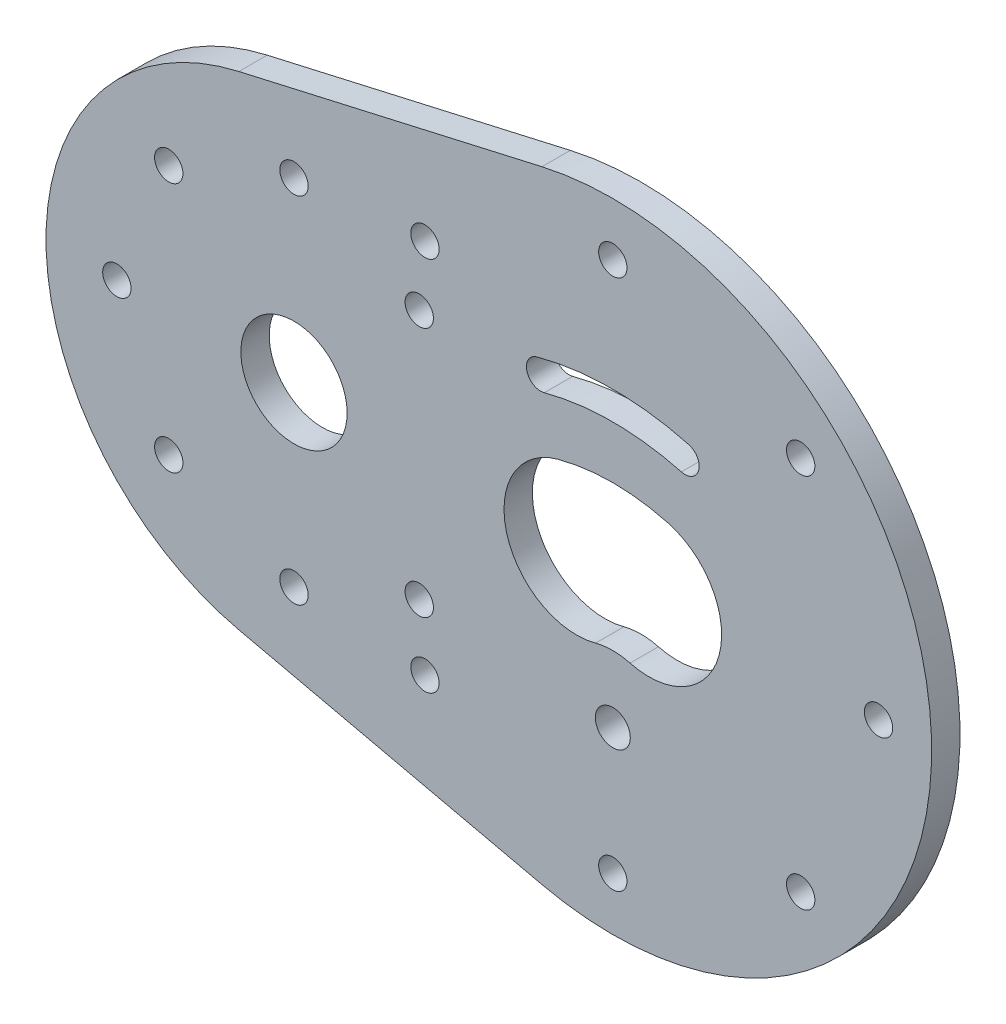
ISO-10303-21;
HEADER;
FILE_DESCRIPTION(('STEP AP214'),'2;1');
FILE_NAME('part.step','',(''),(''),'','','');
FILE_SCHEMA(('AUTOMOTIVE_DESIGN { 1 0 10303 214 1 1 1 1 }'));
ENDSEC;
DATA;
#1=APPLICATION_CONTEXT('core data for automotive mechanical design processes');
#2=APPLICATION_PROTOCOL_DEFINITION('international standard','automotive_design',2000,#1);
#3=PRODUCT_CONTEXT('',#1,'mechanical');
#4=PRODUCT('Part','Part','',(#3));
#5=PRODUCT_RELATED_PRODUCT_CATEGORY('part','',(#4));
#6=PRODUCT_DEFINITION_FORMATION('','',#4);
#7=PRODUCT_DEFINITION_CONTEXT('part definition',#1,'design');
#8=PRODUCT_DEFINITION('design','',#6,#7);
#9=PRODUCT_DEFINITION_SHAPE('','',#8);
#10=(LENGTH_UNIT() NAMED_UNIT(*) SI_UNIT(.MILLI.,.METRE.));
#11=(NAMED_UNIT(*) PLANE_ANGLE_UNIT() SI_UNIT($,.RADIAN.));
#12=(NAMED_UNIT(*) SI_UNIT($,.STERADIAN.) SOLID_ANGLE_UNIT());
#13=UNCERTAINTY_MEASURE_WITH_UNIT(LENGTH_MEASURE(1.E-05),#10,'distance_accuracy_value','');
#14=(GEOMETRIC_REPRESENTATION_CONTEXT(3) GLOBAL_UNCERTAINTY_ASSIGNED_CONTEXT((#13)) GLOBAL_UNIT_ASSIGNED_CONTEXT((#10,
#11,#12)) REPRESENTATION_CONTEXT('',''));
#15=CARTESIAN_POINT('',(0.,0.,0.));
#16=DIRECTION('',(0.,0.,1.));
#17=DIRECTION('',(1.,0.,0.));
#18=AXIS2_PLACEMENT_3D('',#15,#16,#17);
#19=CARTESIAN_POINT('',(35.4686704501793,-31.95,2.54));
#20=DIRECTION('',(0.,0.,1.));
#21=DIRECTION('',(1.,0.,0.));
#22=AXIS2_PLACEMENT_3D('',#19,#20,#21);
#23=PLANE('',#22);
#24=CARTESIAN_POINT('',(-16.8379802270047,29.3379802270047,2.54));
#25=DIRECTION('',(0.,0.,1.));
#26=DIRECTION('',(1.,0.,0.));
#27=AXIS2_PLACEMENT_3D('',#24,#25,#26);
#28=CIRCLE('',#27,1.27);
#29=CARTESIAN_POINT('',(-15.5679802270047,29.3379802270047,2.54));
#30=VERTEX_POINT('',#29);
#31=EDGE_CURVE('E333',#30,#30,#28,.T.);
#32=ORIENTED_EDGE('',*,*,#31,.F.);
#33=EDGE_LOOP('',(#32));
#34=FACE_BOUND('',#33,.T.);
#35=CARTESIAN_POINT('',(-16.8379802270047,-4.33798022700466,2.54));
#36=DIRECTION('',(0.,0.,1.));
#37=DIRECTION('',(1.,0.,0.));
#38=AXIS2_PLACEMENT_3D('',#35,#36,#37);
#39=CIRCLE('',#38,1.27000000000001);
#40=CARTESIAN_POINT('',(-15.5679802270046,-4.33798022700466,2.54));
#41=VERTEX_POINT('',#40);
#42=EDGE_CURVE('E327',#41,#41,#39,.T.);
#43=ORIENTED_EDGE('',*,*,#42,.F.);
#44=EDGE_LOOP('',(#43));
#45=FACE_BOUND('',#44,.T.);
#46=CARTESIAN_POINT('',(0.,-11.3125,2.54));
#47=DIRECTION('',(0.,0.,1.));
#48=DIRECTION('',(1.,0.,0.));
#49=AXIS2_PLACEMENT_3D('',#46,#47,#48);
#50=CIRCLE('',#49,1.27);
#51=CARTESIAN_POINT('',(1.27,-11.3125,2.54));
#52=VERTEX_POINT('',#51);
#53=EDGE_CURVE('E321',#52,#52,#50,.T.);
#54=ORIENTED_EDGE('',*,*,#53,.F.);
#55=EDGE_LOOP('',(#54));
#56=FACE_BOUND('',#55,.T.);
#57=CARTESIAN_POINT('',(16.8379802270047,-4.33798022700466,2.54));
#58=DIRECTION('',(0.,0.,1.));
#59=DIRECTION('',(1.,0.,0.));
#60=AXIS2_PLACEMENT_3D('',#57,#58,#59);
#61=CIRCLE('',#60,1.27);
#62=CARTESIAN_POINT('',(18.1079802270047,-4.33798022700466,2.54));
#63=VERTEX_POINT('',#62);
#64=EDGE_CURVE('E315',#63,#63,#61,.T.);
#65=ORIENTED_EDGE('',*,*,#64,.F.);
#66=EDGE_LOOP('',(#65));
#67=FACE_BOUND('',#66,.T.);
#68=CARTESIAN_POINT('',(23.8125,12.5,2.54));
#69=DIRECTION('',(0.,0.,1.));
#70=DIRECTION('',(1.,0.,0.));
#71=AXIS2_PLACEMENT_3D('',#68,#69,#70);
#72=CIRCLE('',#71,1.27);
#73=CARTESIAN_POINT('',(25.0825,12.5,2.54));
#74=VERTEX_POINT('',#73);
#75=EDGE_CURVE('E309',#74,#74,#72,.T.);
#76=ORIENTED_EDGE('',*,*,#75,.F.);
#77=EDGE_LOOP('',(#76));
#78=FACE_BOUND('',#77,.T.);
#79=CARTESIAN_POINT('',(16.8379802270047,29.3379802270047,2.54));
#80=DIRECTION('',(0.,0.,1.));
#81=DIRECTION('',(1.,0.,0.));
#82=AXIS2_PLACEMENT_3D('',#79,#80,#81);
#83=CIRCLE('',#82,1.27);
#84=CARTESIAN_POINT('',(18.1079802270047,29.3379802270047,2.54));
#85=VERTEX_POINT('',#84);
#86=EDGE_CURVE('E303',#85,#85,#83,.T.);
#87=ORIENTED_EDGE('',*,*,#86,.F.);
#88=EDGE_LOOP('',(#87));
#89=FACE_BOUND('',#88,.T.);
#90=CARTESIAN_POINT('',(-39.8003201513362,23.7253201513364,2.54));
#91=DIRECTION('',(0.,0.,1.));
#92=DIRECTION('',(1.,0.,0.));
#93=AXIS2_PLACEMENT_3D('',#90,#91,#92);
#94=CIRCLE('',#93,1.27);
#95=CARTESIAN_POINT('',(-38.5303201513362,23.7253201513364,2.54));
#96=VERTEX_POINT('',#95);
#97=EDGE_CURVE('E297',#96,#96,#94,.T.);
#98=ORIENTED_EDGE('',*,*,#97,.F.);
#99=EDGE_LOOP('',(#98));
#100=FACE_BOUND('',#99,.T.);
#101=CARTESIAN_POINT('',(-44.4499999999998,12.5,2.54));
#102=DIRECTION('',(0.,0.,1.));
#103=DIRECTION('',(1.,0.,0.));
#104=AXIS2_PLACEMENT_3D('',#101,#102,#103);
#105=CIRCLE('',#104,1.27);
#106=CARTESIAN_POINT('',(-43.1799999999998,12.5,2.54));
#107=VERTEX_POINT('',#106);
#108=EDGE_CURVE('E291',#107,#107,#105,.T.);
#109=ORIENTED_EDGE('',*,*,#108,.F.);
#110=EDGE_LOOP('',(#109));
#111=FACE_BOUND('',#110,.T.);
#112=CARTESIAN_POINT('',(-39.8003201513362,1.2746798486635,2.54));
#113=DIRECTION('',(0.,0.,1.));
#114=DIRECTION('',(1.,0.,0.));
#115=AXIS2_PLACEMENT_3D('',#112,#113,#114);
#116=CIRCLE('',#115,1.27);
#117=CARTESIAN_POINT('',(-38.5303201513362,1.2746798486635,2.54));
#118=VERTEX_POINT('',#117);
#119=EDGE_CURVE('E285',#118,#118,#116,.T.);
#120=ORIENTED_EDGE('',*,*,#119,.F.);
#121=EDGE_LOOP('',(#120));
#122=FACE_BOUND('',#121,.T.);
#123=CARTESIAN_POINT('',(-28.5749999999997,-3.375,2.54));
#124=DIRECTION('',(0.,0.,1.));
#125=DIRECTION('',(1.,0.,0.));
#126=AXIS2_PLACEMENT_3D('',#123,#124,#125);
#127=CIRCLE('',#126,1.27);
#128=CARTESIAN_POINT('',(-27.3049999999997,-3.375,2.54));
#129=VERTEX_POINT('',#128);
#130=EDGE_CURVE('E279',#129,#129,#127,.T.);
#131=ORIENTED_EDGE('',*,*,#130,.F.);
#132=EDGE_LOOP('',(#131));
#133=FACE_BOUND('',#132,.T.);
#134=CARTESIAN_POINT('',(-17.3496798486632,1.27467984866366,2.54));
#135=DIRECTION('',(0.,0.,1.));
#136=DIRECTION('',(1.,0.,0.));
#137=AXIS2_PLACEMENT_3D('',#134,#135,#136);
#138=CIRCLE('',#137,1.27);
#139=CARTESIAN_POINT('',(-16.0796798486632,1.27467984866366,2.54));
#140=VERTEX_POINT('',#139);
#141=EDGE_CURVE('E273',#140,#140,#138,.T.);
#142=ORIENTED_EDGE('',*,*,#141,.F.);
#143=EDGE_LOOP('',(#142));
#144=FACE_BOUND('',#143,.T.);
#145=CARTESIAN_POINT('',(-17.3496798486635,23.7253201513366,2.54));
#146=DIRECTION('',(0.,0.,1.));
#147=DIRECTION('',(1.,0.,0.));
#148=AXIS2_PLACEMENT_3D('',#145,#146,#147);
#149=CIRCLE('',#148,1.27000000000001);
#150=CARTESIAN_POINT('',(-16.0796798486635,23.7253201513366,2.54));
#151=VERTEX_POINT('',#150);
#152=EDGE_CURVE('E267',#151,#151,#149,.T.);
#153=ORIENTED_EDGE('',*,*,#152,.F.);
#154=EDGE_LOOP('',(#153));
#155=FACE_BOUND('',#154,.T.);
#156=CARTESIAN_POINT('',(0.,36.3125,2.54));
#157=DIRECTION('',(0.,0.,1.));
#158=DIRECTION('',(1.,0.,0.));
#159=AXIS2_PLACEMENT_3D('',#156,#157,#158);
#160=CIRCLE('',#159,1.27);
#161=CARTESIAN_POINT('',(1.27,36.3125,2.54));
#162=VERTEX_POINT('',#161);
#163=EDGE_CURVE('E261',#162,#162,#160,.T.);
#164=ORIENTED_EDGE('',*,*,#163,.F.);
#165=EDGE_LOOP('',(#164));
#166=FACE_BOUND('',#165,.T.);
#167=CARTESIAN_POINT('',(-28.575,28.375,2.54));
#168=DIRECTION('',(0.,0.,1.));
#169=DIRECTION('',(1.,0.,0.));
#170=AXIS2_PLACEMENT_3D('',#167,#168,#169);
#171=CIRCLE('',#170,1.27);
#172=CARTESIAN_POINT('',(-27.305,28.375,2.54));
#173=VERTEX_POINT('',#172);
#174=EDGE_CURVE('E255',#173,#173,#171,.T.);
#175=ORIENTED_EDGE('',*,*,#174,.F.);
#176=EDGE_LOOP('',(#175));
#177=FACE_BOUND('',#176,.T.);
#178=CARTESIAN_POINT('',(-28.575,12.5,2.54));
#179=DIRECTION('',(0.,0.,1.));
#180=DIRECTION('',(1.,0.,0.));
#181=AXIS2_PLACEMENT_3D('',#178,#179,#180);
#182=CIRCLE('',#181,4.7625);
#183=CARTESIAN_POINT('',(-23.8125,12.5,2.54));
#184=VERTEX_POINT('',#183);
#185=EDGE_CURVE('E155',#184,#184,#182,.T.);
#186=ORIENTED_EDGE('',*,*,#185,.F.);
#187=EDGE_LOOP('',(#186));
#188=FACE_BOUND('',#187,.T.);
#189=CARTESIAN_POINT('',(0.,0.,2.54));
#190=DIRECTION('',(0.,0.,1.));
#191=DIRECTION('',(1.,0.,0.));
#192=AXIS2_PLACEMENT_3D('',#189,#190,#191);
#193=CIRCLE('',#192,1.56488027551501);
#194=CARTESIAN_POINT('',(1.56488027551501,0.,2.54));
#195=VERTEX_POINT('',#194);
#196=EDGE_CURVE('E192',#195,#195,#193,.T.);
#197=ORIENTED_EDGE('',*,*,#196,.F.);
#198=EDGE_LOOP('',(#197));
#199=FACE_BOUND('',#198,.T.);
#200=CARTESIAN_POINT('',(3.23523806378152,12.0740728286134,2.54));
#201=DIRECTION('',(0.,0.,1.));
#202=DIRECTION('',(-1.,0.,0.));
#203=AXIS2_PLACEMENT_3D('',#200,#201,#202);
#204=CIRCLE('',#203,6.5151);
#205=CARTESIAN_POINT('',(1.54900610303408,5.78096947775744,2.54));
#206=VERTEX_POINT('',#205);
#207=CARTESIAN_POINT('',(4.92147002452896,18.3671761794693,2.54));
#208=VERTEX_POINT('',#207);
#209=EDGE_CURVE('E200',#206,#208,#204,.T.);
#210=ORIENTED_EDGE('',*,*,#209,.F.);
#211=CARTESIAN_POINT('',(0.,0.,2.54));
#212=DIRECTION('',(0.,0.,-1.));
#213=DIRECTION('',(1.,0.,0.));
#214=AXIS2_PLACEMENT_3D('',#211,#212,#213);
#215=CIRCLE('',#214,5.9849);
#216=CARTESIAN_POINT('',(-1.54900610303408,5.78096947775744,2.54));
#217=VERTEX_POINT('',#216);
#218=EDGE_CURVE('E198',#217,#206,#215,.T.);
#219=ORIENTED_EDGE('',*,*,#218,.F.);
#220=CARTESIAN_POINT('',(-3.23523806378152,12.0740728286134,2.54));
#221=DIRECTION('',(0.,0.,1.));
#222=DIRECTION('',(1.,0.,0.));
#223=AXIS2_PLACEMENT_3D('',#220,#221,#222);
#224=CIRCLE('',#223,6.5151);
#225=CARTESIAN_POINT('',(-4.92147002452896,18.3671761794693,2.54));
#226=VERTEX_POINT('',#225);
#227=EDGE_CURVE('E206',#226,#217,#224,.T.);
#228=ORIENTED_EDGE('',*,*,#227,.F.);
#229=CARTESIAN_POINT('',(0.,0.,2.54));
#230=DIRECTION('',(0.,0.,1.));
#231=DIRECTION('',(1.,0.,0.));
#232=AXIS2_PLACEMENT_3D('',#229,#230,#231);
#233=CIRCLE('',#232,19.0151);
#234=EDGE_CURVE('E203',#208,#226,#233,.T.);
#235=ORIENTED_EDGE('',*,*,#234,.F.);
#236=EDGE_LOOP('',(#210,#219,#228,#235));
#237=FACE_BOUND('',#236,.T.);
#238=CARTESIAN_POINT('',(0.,0.,2.54));
#239=DIRECTION('',(0.,0.,-1.));
#240=DIRECTION('',(1.,0.,0.));
#241=AXIS2_PLACEMENT_3D('',#238,#239,#240);
#242=CIRCLE('',#241,23.73);
#243=CARTESIAN_POINT('',(-6.14177594028284,22.9214198578396,2.54));
#244=VERTEX_POINT('',#243);
#245=CARTESIAN_POINT('',(6.14177594028284,22.9214198578396,2.54));
#246=VERTEX_POINT('',#245);
#247=EDGE_CURVE('E163',#244,#246,#242,.T.);
#248=ORIENTED_EDGE('',*,*,#247,.F.);
#249=CARTESIAN_POINT('',(-6.47047612756304,24.1481456572267,2.54));
#250=DIRECTION('',(0.,0.,1.));
#251=DIRECTION('',(1.,0.,0.));
#252=AXIS2_PLACEMENT_3D('',#249,#250,#251);
#253=CIRCLE('',#252,1.27);
#254=CARTESIAN_POINT('',(-6.79917631484324,25.3748714566138,2.54));
#255=VERTEX_POINT('',#254);
#256=EDGE_CURVE('E161',#255,#244,#253,.T.);
#257=ORIENTED_EDGE('',*,*,#256,.F.);
#258=CARTESIAN_POINT('',(0.,0.,2.54));
#259=DIRECTION('',(0.,0.,1.));
#260=DIRECTION('',(1.,0.,0.));
#261=AXIS2_PLACEMENT_3D('',#258,#259,#260);
#262=CIRCLE('',#261,26.27);
#263=CARTESIAN_POINT('',(6.79917631484324,25.3748714566138,2.54));
#264=VERTEX_POINT('',#263);
#265=EDGE_CURVE('E169',#264,#255,#262,.T.);
#266=ORIENTED_EDGE('',*,*,#265,.F.);
#267=CARTESIAN_POINT('',(6.47047612756304,24.1481456572267,2.54));
#268=DIRECTION('',(0.,0.,1.));
#269=DIRECTION('',(-1.,0.,0.));
#270=AXIS2_PLACEMENT_3D('',#267,#268,#269);
#271=CIRCLE('',#270,1.27);
#272=EDGE_CURVE('E166',#246,#264,#271,.T.);
#273=ORIENTED_EDGE('',*,*,#272,.F.);
#274=EDGE_LOOP('',(#248,#257,#266,#273));
#275=FACE_BOUND('',#274,.T.);
#276=DIRECTION('',(-0.974996043043569,-0.222222222222222,0.));
#277=VECTOR('',#276,1.);
#278=CARTESIAN_POINT('',(-33.5138888888889,34.1692870566433,2.54));
#279=LINE('',#278,#277);
#280=CARTESIAN_POINT('',(-6.35000000000002,40.36051192997,2.54));
#281=VERTEX_POINT('',#280);
#282=CARTESIAN_POINT('',(-33.5138888888889,34.1692870566433,2.54));
#283=VERTEX_POINT('',#282);
#284=EDGE_CURVE('E126',#281,#283,#279,.T.);
#285=ORIENTED_EDGE('',*,*,#284,.T.);
#286=CARTESIAN_POINT('',(-28.575,12.5,2.54));
#287=DIRECTION('',(0.,0.,1.));
#288=DIRECTION('',(1.,0.,0.));
#289=AXIS2_PLACEMENT_3D('',#286,#287,#288);
#290=CIRCLE('',#289,22.225);
#291=CARTESIAN_POINT('',(-33.5138888888889,-9.16928705664331,2.54));
#292=VERTEX_POINT('',#291);
#293=EDGE_CURVE('E143',#283,#292,#290,.T.);
#294=ORIENTED_EDGE('',*,*,#293,.T.);
#295=DIRECTION('',(0.974996043043569,-0.222222222222222,0.));
#296=VECTOR('',#295,1.);
#297=CARTESIAN_POINT('',(-33.5138888888889,-9.16928705664331,2.54));
#298=LINE('',#297,#296);
#299=CARTESIAN_POINT('',(-6.34999999999999,-15.36051192997,2.54));
#300=VERTEX_POINT('',#299);
#301=EDGE_CURVE('E146',#292,#300,#298,.T.);
#302=ORIENTED_EDGE('',*,*,#301,.T.);
#303=CARTESIAN_POINT('',(0.,12.5,2.54));
#304=DIRECTION('',(0.,0.,1.));
#305=DIRECTION('',(1.,0.,0.));
#306=AXIS2_PLACEMENT_3D('',#303,#304,#305);
#307=CIRCLE('',#306,28.575);
#308=EDGE_CURVE('E46',#300,#281,#307,.T.);
#309=ORIENTED_EDGE('',*,*,#308,.T.);
#310=EDGE_LOOP('',(#285,#294,#302,#309));
#311=FACE_BOUND('',#310,.T.);
#312=ADVANCED_FACE('F31',(#34,#45,#56,#67,#78,#89,#100,#111,#122,#133,#144,#155,#166,#177,#188,
#199,#237,#275,#311),#23,.T.);
#313=CARTESIAN_POINT('',(35.4686704501793,-31.95,0.));
#314=DIRECTION('',(0.,0.,1.));
#315=DIRECTION('',(1.,0.,0.));
#316=AXIS2_PLACEMENT_3D('',#313,#314,#315);
#317=PLANE('',#316);
#318=CARTESIAN_POINT('',(-16.8379802270047,29.3379802270047,0.));
#319=DIRECTION('',(0.,0.,1.));
#320=DIRECTION('',(1.,0.,0.));
#321=AXIS2_PLACEMENT_3D('',#318,#319,#320);
#322=CIRCLE('',#321,1.27);
#323=CARTESIAN_POINT('',(-15.5679802270047,29.3379802270047,0.));
#324=VERTEX_POINT('',#323);
#325=EDGE_CURVE('E330',#324,#324,#322,.T.);
#326=ORIENTED_EDGE('',*,*,#325,.T.);
#327=EDGE_LOOP('',(#326));
#328=FACE_BOUND('',#327,.T.);
#329=CARTESIAN_POINT('',(-16.8379802270047,-4.33798022700466,0.));
#330=DIRECTION('',(0.,0.,1.));
#331=DIRECTION('',(1.,0.,0.));
#332=AXIS2_PLACEMENT_3D('',#329,#330,#331);
#333=CIRCLE('',#332,1.27000000000001);
#334=CARTESIAN_POINT('',(-15.5679802270046,-4.33798022700466,0.));
#335=VERTEX_POINT('',#334);
#336=EDGE_CURVE('E324',#335,#335,#333,.T.);
#337=ORIENTED_EDGE('',*,*,#336,.T.);
#338=EDGE_LOOP('',(#337));
#339=FACE_BOUND('',#338,.T.);
#340=CARTESIAN_POINT('',(0.,-11.3125,0.));
#341=DIRECTION('',(0.,0.,1.));
#342=DIRECTION('',(1.,0.,0.));
#343=AXIS2_PLACEMENT_3D('',#340,#341,#342);
#344=CIRCLE('',#343,1.27);
#345=CARTESIAN_POINT('',(1.27,-11.3125,0.));
#346=VERTEX_POINT('',#345);
#347=EDGE_CURVE('E318',#346,#346,#344,.T.);
#348=ORIENTED_EDGE('',*,*,#347,.T.);
#349=EDGE_LOOP('',(#348));
#350=FACE_BOUND('',#349,.T.);
#351=CARTESIAN_POINT('',(16.8379802270047,-4.33798022700466,0.));
#352=DIRECTION('',(0.,0.,1.));
#353=DIRECTION('',(1.,0.,0.));
#354=AXIS2_PLACEMENT_3D('',#351,#352,#353);
#355=CIRCLE('',#354,1.27);
#356=CARTESIAN_POINT('',(18.1079802270047,-4.33798022700466,0.));
#357=VERTEX_POINT('',#356);
#358=EDGE_CURVE('E312',#357,#357,#355,.T.);
#359=ORIENTED_EDGE('',*,*,#358,.T.);
#360=EDGE_LOOP('',(#359));
#361=FACE_BOUND('',#360,.T.);
#362=CARTESIAN_POINT('',(23.8125,12.5,0.));
#363=DIRECTION('',(0.,0.,1.));
#364=DIRECTION('',(1.,0.,0.));
#365=AXIS2_PLACEMENT_3D('',#362,#363,#364);
#366=CIRCLE('',#365,1.27);
#367=CARTESIAN_POINT('',(25.0825,12.5,0.));
#368=VERTEX_POINT('',#367);
#369=EDGE_CURVE('E306',#368,#368,#366,.T.);
#370=ORIENTED_EDGE('',*,*,#369,.T.);
#371=EDGE_LOOP('',(#370));
#372=FACE_BOUND('',#371,.T.);
#373=CARTESIAN_POINT('',(16.8379802270047,29.3379802270047,0.));
#374=DIRECTION('',(0.,0.,1.));
#375=DIRECTION('',(1.,0.,0.));
#376=AXIS2_PLACEMENT_3D('',#373,#374,#375);
#377=CIRCLE('',#376,1.27);
#378=CARTESIAN_POINT('',(18.1079802270047,29.3379802270047,0.));
#379=VERTEX_POINT('',#378);
#380=EDGE_CURVE('E300',#379,#379,#377,.T.);
#381=ORIENTED_EDGE('',*,*,#380,.T.);
#382=EDGE_LOOP('',(#381));
#383=FACE_BOUND('',#382,.T.);
#384=CARTESIAN_POINT('',(-39.8003201513362,23.7253201513364,0.));
#385=DIRECTION('',(0.,0.,1.));
#386=DIRECTION('',(1.,0.,0.));
#387=AXIS2_PLACEMENT_3D('',#384,#385,#386);
#388=CIRCLE('',#387,1.27);
#389=CARTESIAN_POINT('',(-38.5303201513362,23.7253201513364,0.));
#390=VERTEX_POINT('',#389);
#391=EDGE_CURVE('E294',#390,#390,#388,.T.);
#392=ORIENTED_EDGE('',*,*,#391,.T.);
#393=EDGE_LOOP('',(#392));
#394=FACE_BOUND('',#393,.T.);
#395=CARTESIAN_POINT('',(-44.4499999999998,12.5,0.));
#396=DIRECTION('',(0.,0.,1.));
#397=DIRECTION('',(1.,0.,0.));
#398=AXIS2_PLACEMENT_3D('',#395,#396,#397);
#399=CIRCLE('',#398,1.27);
#400=CARTESIAN_POINT('',(-43.1799999999998,12.5,0.));
#401=VERTEX_POINT('',#400);
#402=EDGE_CURVE('E288',#401,#401,#399,.T.);
#403=ORIENTED_EDGE('',*,*,#402,.T.);
#404=EDGE_LOOP('',(#403));
#405=FACE_BOUND('',#404,.T.);
#406=CARTESIAN_POINT('',(-39.8003201513362,1.2746798486635,0.));
#407=DIRECTION('',(0.,0.,1.));
#408=DIRECTION('',(1.,0.,0.));
#409=AXIS2_PLACEMENT_3D('',#406,#407,#408);
#410=CIRCLE('',#409,1.27);
#411=CARTESIAN_POINT('',(-38.5303201513362,1.2746798486635,0.));
#412=VERTEX_POINT('',#411);
#413=EDGE_CURVE('E282',#412,#412,#410,.T.);
#414=ORIENTED_EDGE('',*,*,#413,.T.);
#415=EDGE_LOOP('',(#414));
#416=FACE_BOUND('',#415,.T.);
#417=CARTESIAN_POINT('',(-28.5749999999997,-3.375,0.));
#418=DIRECTION('',(0.,0.,1.));
#419=DIRECTION('',(1.,0.,0.));
#420=AXIS2_PLACEMENT_3D('',#417,#418,#419);
#421=CIRCLE('',#420,1.27);
#422=CARTESIAN_POINT('',(-27.3049999999997,-3.375,0.));
#423=VERTEX_POINT('',#422);
#424=EDGE_CURVE('E276',#423,#423,#421,.T.);
#425=ORIENTED_EDGE('',*,*,#424,.T.);
#426=EDGE_LOOP('',(#425));
#427=FACE_BOUND('',#426,.T.);
#428=CARTESIAN_POINT('',(-17.3496798486632,1.27467984866366,0.));
#429=DIRECTION('',(0.,0.,1.));
#430=DIRECTION('',(1.,0.,0.));
#431=AXIS2_PLACEMENT_3D('',#428,#429,#430);
#432=CIRCLE('',#431,1.27);
#433=CARTESIAN_POINT('',(-16.0796798486632,1.27467984866366,0.));
#434=VERTEX_POINT('',#433);
#435=EDGE_CURVE('E270',#434,#434,#432,.T.);
#436=ORIENTED_EDGE('',*,*,#435,.T.);
#437=EDGE_LOOP('',(#436));
#438=FACE_BOUND('',#437,.T.);
#439=CARTESIAN_POINT('',(-17.3496798486635,23.7253201513366,0.));
#440=DIRECTION('',(0.,0.,1.));
#441=DIRECTION('',(1.,0.,0.));
#442=AXIS2_PLACEMENT_3D('',#439,#440,#441);
#443=CIRCLE('',#442,1.27000000000001);
#444=CARTESIAN_POINT('',(-16.0796798486635,23.7253201513366,0.));
#445=VERTEX_POINT('',#444);
#446=EDGE_CURVE('E264',#445,#445,#443,.T.);
#447=ORIENTED_EDGE('',*,*,#446,.T.);
#448=EDGE_LOOP('',(#447));
#449=FACE_BOUND('',#448,.T.);
#450=CARTESIAN_POINT('',(0.,36.3125,0.));
#451=DIRECTION('',(0.,0.,1.));
#452=DIRECTION('',(1.,0.,0.));
#453=AXIS2_PLACEMENT_3D('',#450,#451,#452);
#454=CIRCLE('',#453,1.27);
#455=CARTESIAN_POINT('',(1.27,36.3125,0.));
#456=VERTEX_POINT('',#455);
#457=EDGE_CURVE('E258',#456,#456,#454,.T.);
#458=ORIENTED_EDGE('',*,*,#457,.T.);
#459=EDGE_LOOP('',(#458));
#460=FACE_BOUND('',#459,.T.);
#461=CARTESIAN_POINT('',(-28.575,28.375,0.));
#462=DIRECTION('',(0.,0.,1.));
#463=DIRECTION('',(1.,0.,0.));
#464=AXIS2_PLACEMENT_3D('',#461,#462,#463);
#465=CIRCLE('',#464,1.27);
#466=CARTESIAN_POINT('',(-27.305,28.375,0.));
#467=VERTEX_POINT('',#466);
#468=EDGE_CURVE('E147',#467,#467,#465,.T.);
#469=ORIENTED_EDGE('',*,*,#468,.T.);
#470=EDGE_LOOP('',(#469));
#471=FACE_BOUND('',#470,.T.);
#472=CARTESIAN_POINT('',(-28.575,12.5,0.));
#473=DIRECTION('',(0.,0.,1.));
#474=DIRECTION('',(1.,0.,0.));
#475=AXIS2_PLACEMENT_3D('',#472,#473,#474);
#476=CIRCLE('',#475,4.7625);
#477=CARTESIAN_POINT('',(-23.8125,12.5,0.));
#478=VERTEX_POINT('',#477);
#479=EDGE_CURVE('E152',#478,#478,#476,.T.);
#480=ORIENTED_EDGE('',*,*,#479,.T.);
#481=EDGE_LOOP('',(#480));
#482=FACE_BOUND('',#481,.T.);
#483=CARTESIAN_POINT('',(0.,0.,0.));
#484=DIRECTION('',(0.,0.,1.));
#485=DIRECTION('',(1.,0.,0.));
#486=AXIS2_PLACEMENT_3D('',#483,#484,#485);
#487=CIRCLE('',#486,1.56488027551501);
#488=CARTESIAN_POINT('',(1.56488027551501,0.,0.));
#489=VERTEX_POINT('',#488);
#490=EDGE_CURVE('E191',#489,#489,#487,.T.);
#491=ORIENTED_EDGE('',*,*,#490,.T.);
#492=EDGE_LOOP('',(#491));
#493=FACE_BOUND('',#492,.T.);
#494=CARTESIAN_POINT('',(0.,0.,0.));
#495=DIRECTION('',(0.,0.,-1.));
#496=DIRECTION('',(1.,0.,0.));
#497=AXIS2_PLACEMENT_3D('',#494,#495,#496);
#498=CIRCLE('',#497,5.9849);
#499=CARTESIAN_POINT('',(-1.54900610303408,5.78096947775744,0.));
#500=VERTEX_POINT('',#499);
#501=CARTESIAN_POINT('',(1.54900610303408,5.78096947775744,0.));
#502=VERTEX_POINT('',#501);
#503=EDGE_CURVE('E195',#500,#502,#498,.T.);
#504=ORIENTED_EDGE('',*,*,#503,.T.);
#505=CARTESIAN_POINT('',(3.23523806378152,12.0740728286134,0.));
#506=DIRECTION('',(0.,0.,1.));
#507=DIRECTION('',(-1.,0.,0.));
#508=AXIS2_PLACEMENT_3D('',#505,#506,#507);
#509=CIRCLE('',#508,6.5151);
#510=CARTESIAN_POINT('',(4.92147002452896,18.3671761794693,0.));
#511=VERTEX_POINT('',#510);
#512=EDGE_CURVE('E211',#502,#511,#509,.T.);
#513=ORIENTED_EDGE('',*,*,#512,.T.);
#514=CARTESIAN_POINT('',(0.,0.,0.));
#515=DIRECTION('',(0.,0.,1.));
#516=DIRECTION('',(1.,0.,0.));
#517=AXIS2_PLACEMENT_3D('',#514,#515,#516);
#518=CIRCLE('',#517,19.0151);
#519=CARTESIAN_POINT('',(-4.92147002452896,18.3671761794693,0.));
#520=VERTEX_POINT('',#519);
#521=EDGE_CURVE('E214',#511,#520,#518,.T.);
#522=ORIENTED_EDGE('',*,*,#521,.T.);
#523=CARTESIAN_POINT('',(-3.23523806378152,12.0740728286134,0.));
#524=DIRECTION('',(0.,0.,1.));
#525=DIRECTION('',(1.,0.,0.));
#526=AXIS2_PLACEMENT_3D('',#523,#524,#525);
#527=CIRCLE('',#526,6.5151);
#528=EDGE_CURVE('E201',#520,#500,#527,.T.);
#529=ORIENTED_EDGE('',*,*,#528,.T.);
#530=EDGE_LOOP('',(#504,#513,#522,#529));
#531=FACE_BOUND('',#530,.T.);
#532=CARTESIAN_POINT('',(-6.47047612756304,24.1481456572267,0.));
#533=DIRECTION('',(0.,0.,1.));
#534=DIRECTION('',(1.,0.,0.));
#535=AXIS2_PLACEMENT_3D('',#532,#533,#534);
#536=CIRCLE('',#535,1.27);
#537=CARTESIAN_POINT('',(-6.79917631484324,25.3748714566138,0.));
#538=VERTEX_POINT('',#537);
#539=CARTESIAN_POINT('',(-6.14177594028284,22.9214198578396,0.));
#540=VERTEX_POINT('',#539);
#541=EDGE_CURVE('E158',#538,#540,#536,.T.);
#542=ORIENTED_EDGE('',*,*,#541,.T.);
#543=CARTESIAN_POINT('',(0.,0.,0.));
#544=DIRECTION('',(0.,0.,-1.));
#545=DIRECTION('',(1.,0.,0.));
#546=AXIS2_PLACEMENT_3D('',#543,#544,#545);
#547=CIRCLE('',#546,23.73);
#548=CARTESIAN_POINT('',(6.14177594028284,22.9214198578396,0.));
#549=VERTEX_POINT('',#548);
#550=EDGE_CURVE('E174',#540,#549,#547,.T.);
#551=ORIENTED_EDGE('',*,*,#550,.T.);
#552=CARTESIAN_POINT('',(6.47047612756304,24.1481456572267,0.));
#553=DIRECTION('',(0.,0.,1.));
#554=DIRECTION('',(-1.,0.,0.));
#555=AXIS2_PLACEMENT_3D('',#552,#553,#554);
#556=CIRCLE('',#555,1.27);
#557=CARTESIAN_POINT('',(6.79917631484324,25.3748714566138,0.));
#558=VERTEX_POINT('',#557);
#559=EDGE_CURVE('E177',#549,#558,#556,.T.);
#560=ORIENTED_EDGE('',*,*,#559,.T.);
#561=CARTESIAN_POINT('',(0.,0.,0.));
#562=DIRECTION('',(0.,0.,1.));
#563=DIRECTION('',(1.,0.,0.));
#564=AXIS2_PLACEMENT_3D('',#561,#562,#563);
#565=CIRCLE('',#564,26.27);
#566=EDGE_CURVE('E164',#558,#538,#565,.T.);
#567=ORIENTED_EDGE('',*,*,#566,.T.);
#568=EDGE_LOOP('',(#542,#551,#560,#567));
#569=FACE_BOUND('',#568,.T.);
#570=CARTESIAN_POINT('',(-28.575,12.5,0.));
#571=DIRECTION('',(0.,0.,1.));
#572=DIRECTION('',(1.,0.,0.));
#573=AXIS2_PLACEMENT_3D('',#570,#571,#572);
#574=CIRCLE('',#573,22.225);
#575=CARTESIAN_POINT('',(-33.5138888888889,34.1692870566433,0.));
#576=VERTEX_POINT('',#575);
#577=CARTESIAN_POINT('',(-33.5138888888889,-9.16928705664331,0.));
#578=VERTEX_POINT('',#577);
#579=EDGE_CURVE('E54',#576,#578,#574,.T.);
#580=ORIENTED_EDGE('',*,*,#579,.F.);
#581=DIRECTION('',(-0.974996043043569,-0.222222222222222,0.));
#582=VECTOR('',#581,1.);
#583=CARTESIAN_POINT('',(-33.5138888888889,34.1692870566433,0.));
#584=LINE('',#583,#582);
#585=CARTESIAN_POINT('',(-6.35000000000002,40.36051192997,0.));
#586=VERTEX_POINT('',#585);
#587=EDGE_CURVE('E124',#586,#576,#584,.T.);
#588=ORIENTED_EDGE('',*,*,#587,.F.);
#589=CARTESIAN_POINT('',(0.,12.5,0.));
#590=DIRECTION('',(0.,0.,1.));
#591=DIRECTION('',(1.,0.,0.));
#592=AXIS2_PLACEMENT_3D('',#589,#590,#591);
#593=CIRCLE('',#592,28.575);
#594=CARTESIAN_POINT('',(-6.35000000000001,-15.36051192997,0.));
#595=VERTEX_POINT('',#594);
#596=EDGE_CURVE('E131',#595,#586,#593,.T.);
#597=ORIENTED_EDGE('',*,*,#596,.F.);
#598=DIRECTION('',(0.974996043043569,-0.222222222222222,0.));
#599=VECTOR('',#598,1.);
#600=CARTESIAN_POINT('',(-33.5138888888889,-9.16928705664331,0.));
#601=LINE('',#600,#599);
#602=EDGE_CURVE('E136',#578,#595,#601,.T.);
#603=ORIENTED_EDGE('',*,*,#602,.F.);
#604=EDGE_LOOP('',(#580,#588,#597,#603));
#605=FACE_BOUND('',#604,.T.);
#606=ADVANCED_FACE('F33',(#328,#339,#350,#361,#372,#383,#394,#405,#416,#427,#438,#449,#460,#471,
#482,#493,#531,#569,#605),#317,.F.);
#607=CARTESIAN_POINT('',(0.,0.,2.54));
#608=DIRECTION('',(0.,0.,-1.));
#609=DIRECTION('',(-1.,0.,0.));
#610=AXIS2_PLACEMENT_3D('',#607,#608,#609);
#611=CYLINDRICAL_SURFACE('',#610,5.9849);
#612=ORIENTED_EDGE('',*,*,#503,.F.);
#613=DIRECTION('',(0.,0.,-1.));
#614=VECTOR('',#613,1.);
#615=CARTESIAN_POINT('',(-1.54900610303408,5.78096947775744,2.54));
#616=LINE('',#615,#614);
#617=EDGE_CURVE('E208',#217,#500,#616,.T.);
#618=ORIENTED_EDGE('',*,*,#617,.F.);
#619=ORIENTED_EDGE('',*,*,#218,.T.);
#620=DIRECTION('',(0.,0.,-1.));
#621=VECTOR('',#620,1.);
#622=CARTESIAN_POINT('',(1.54900610303408,5.78096947775744,2.54));
#623=LINE('',#622,#621);
#624=EDGE_CURVE('E11',#206,#502,#623,.T.);
#625=ORIENTED_EDGE('',*,*,#624,.T.);
#626=EDGE_LOOP('',(#612,#618,#619,#625));
#627=FACE_BOUND('',#626,.T.);
#628=ADVANCED_FACE('F236',(#627),#611,.T.);
#629=CARTESIAN_POINT('',(3.23523806378152,12.0740728286134,2.54));
#630=DIRECTION('',(0.,0.,-1.));
#631=DIRECTION('',(-1.,0.,0.));
#632=AXIS2_PLACEMENT_3D('',#629,#630,#631);
#633=CYLINDRICAL_SURFACE('',#632,6.5151);
#634=ORIENTED_EDGE('',*,*,#512,.F.);
#635=ORIENTED_EDGE('',*,*,#624,.F.);
#636=ORIENTED_EDGE('',*,*,#209,.T.);
#637=DIRECTION('',(0.,0.,-1.));
#638=VECTOR('',#637,1.);
#639=CARTESIAN_POINT('',(4.92147002452896,18.3671761794693,2.54));
#640=LINE('',#639,#638);
#641=EDGE_CURVE('E39',#208,#511,#640,.T.);
#642=ORIENTED_EDGE('',*,*,#641,.T.);
#643=EDGE_LOOP('',(#634,#635,#636,#642));
#644=FACE_BOUND('',#643,.T.);
#645=ADVANCED_FACE('F225',(#644),#633,.F.);
#646=CARTESIAN_POINT('',(0.,0.,2.54));
#647=DIRECTION('',(0.,0.,-1.));
#648=DIRECTION('',(-1.,0.,0.));
#649=AXIS2_PLACEMENT_3D('',#646,#647,#648);
#650=CYLINDRICAL_SURFACE('',#649,19.0151);
#651=ORIENTED_EDGE('',*,*,#521,.F.);
#652=ORIENTED_EDGE('',*,*,#641,.F.);
#653=ORIENTED_EDGE('',*,*,#234,.T.);
#654=DIRECTION('',(0.,0.,-1.));
#655=VECTOR('',#654,1.);
#656=CARTESIAN_POINT('',(-4.92147002452896,18.3671761794693,2.54));
#657=LINE('',#656,#655);
#658=EDGE_CURVE('E221',#226,#520,#657,.T.);
#659=ORIENTED_EDGE('',*,*,#658,.T.);
#660=EDGE_LOOP('',(#651,#652,#653,#659));
#661=FACE_BOUND('',#660,.T.);
#662=ADVANCED_FACE('F230',(#661),#650,.F.);
#663=CARTESIAN_POINT('',(-3.23523806378152,12.0740728286134,2.54));
#664=DIRECTION('',(0.,0.,-1.));
#665=DIRECTION('',(-1.,0.,0.));
#666=AXIS2_PLACEMENT_3D('',#663,#664,#665);
#667=CYLINDRICAL_SURFACE('',#666,6.5151);
#668=ORIENTED_EDGE('',*,*,#528,.F.);
#669=ORIENTED_EDGE('',*,*,#658,.F.);
#670=ORIENTED_EDGE('',*,*,#227,.T.);
#671=ORIENTED_EDGE('',*,*,#617,.T.);
#672=EDGE_LOOP('',(#668,#669,#670,#671));
#673=FACE_BOUND('',#672,.T.);
#674=ADVANCED_FACE('F239',(#673),#667,.F.);
#675=CARTESIAN_POINT('',(0.,0.,2.54));
#676=DIRECTION('',(0.,0.,-1.));
#677=DIRECTION('',(-1.,0.,0.));
#678=AXIS2_PLACEMENT_3D('',#675,#676,#677);
#679=CYLINDRICAL_SURFACE('',#678,1.56488027551501);
#680=ORIENTED_EDGE('',*,*,#196,.T.);
#681=EDGE_LOOP('',(#680));
#682=FACE_BOUND('',#681,.T.);
#683=ORIENTED_EDGE('',*,*,#490,.F.);
#684=EDGE_LOOP('',(#683));
#685=FACE_BOUND('',#684,.T.);
#686=ADVANCED_FACE('F378',(#682,#685),#679,.F.);
#687=CARTESIAN_POINT('',(-6.47047612756304,24.1481456572267,2.54));
#688=DIRECTION('',(0.,0.,-1.));
#689=DIRECTION('',(-1.,0.,0.));
#690=AXIS2_PLACEMENT_3D('',#687,#688,#689);
#691=CYLINDRICAL_SURFACE('',#690,1.27);
#692=ORIENTED_EDGE('',*,*,#541,.F.);
#693=DIRECTION('',(0.,0.,-1.));
#694=VECTOR('',#693,1.);
#695=CARTESIAN_POINT('',(-6.79917631484324,25.3748714566138,2.54));
#696=LINE('',#695,#694);
#697=EDGE_CURVE('E171',#255,#538,#696,.T.);
#698=ORIENTED_EDGE('',*,*,#697,.F.);
#699=ORIENTED_EDGE('',*,*,#256,.T.);
#700=DIRECTION('',(0.,0.,-1.));
#701=VECTOR('',#700,1.);
#702=CARTESIAN_POINT('',(-6.14177594028284,22.9214198578396,2.54));
#703=LINE('',#702,#701);
#704=EDGE_CURVE('E188',#244,#540,#703,.T.);
#705=ORIENTED_EDGE('',*,*,#704,.T.);
#706=EDGE_LOOP('',(#692,#698,#699,#705));
#707=FACE_BOUND('',#706,.T.);
#708=ADVANCED_FACE('F381',(#707),#691,.F.);
#709=CARTESIAN_POINT('',(0.,0.,2.54));
#710=DIRECTION('',(0.,0.,-1.));
#711=DIRECTION('',(-1.,0.,0.));
#712=AXIS2_PLACEMENT_3D('',#709,#710,#711);
#713=CYLINDRICAL_SURFACE('',#712,23.73);
#714=ORIENTED_EDGE('',*,*,#550,.F.);
#715=ORIENTED_EDGE('',*,*,#704,.F.);
#716=ORIENTED_EDGE('',*,*,#247,.T.);
#717=DIRECTION('',(0.,0.,-1.));
#718=VECTOR('',#717,1.);
#719=CARTESIAN_POINT('',(6.14177594028284,22.9214198578396,2.54));
#720=LINE('',#719,#718);
#721=EDGE_CURVE('E186',#246,#549,#720,.T.);
#722=ORIENTED_EDGE('',*,*,#721,.T.);
#723=EDGE_LOOP('',(#714,#715,#716,#722));
#724=FACE_BOUND('',#723,.T.);
#725=ADVANCED_FACE('F401',(#724),#713,.T.);
#726=CARTESIAN_POINT('',(6.47047612756304,24.1481456572267,2.54));
#727=DIRECTION('',(0.,0.,-1.));
#728=DIRECTION('',(-1.,0.,0.));
#729=AXIS2_PLACEMENT_3D('',#726,#727,#728);
#730=CYLINDRICAL_SURFACE('',#729,1.27);
#731=ORIENTED_EDGE('',*,*,#559,.F.);
#732=ORIENTED_EDGE('',*,*,#721,.F.);
#733=ORIENTED_EDGE('',*,*,#272,.T.);
#734=DIRECTION('',(0.,0.,-1.));
#735=VECTOR('',#734,1.);
#736=CARTESIAN_POINT('',(6.79917631484324,25.3748714566138,2.54));
#737=LINE('',#736,#735);
#738=EDGE_CURVE('E184',#264,#558,#737,.T.);
#739=ORIENTED_EDGE('',*,*,#738,.T.);
#740=EDGE_LOOP('',(#731,#732,#733,#739));
#741=FACE_BOUND('',#740,.T.);
#742=ADVANCED_FACE('F405',(#741),#730,.F.);
#743=CARTESIAN_POINT('',(0.,0.,2.54));
#744=DIRECTION('',(0.,0.,-1.));
#745=DIRECTION('',(-1.,0.,0.));
#746=AXIS2_PLACEMENT_3D('',#743,#744,#745);
#747=CYLINDRICAL_SURFACE('',#746,26.27);
#748=ORIENTED_EDGE('',*,*,#566,.F.);
#749=ORIENTED_EDGE('',*,*,#738,.F.);
#750=ORIENTED_EDGE('',*,*,#265,.T.);
#751=ORIENTED_EDGE('',*,*,#697,.T.);
#752=EDGE_LOOP('',(#748,#749,#750,#751));
#753=FACE_BOUND('',#752,.T.);
#754=ADVANCED_FACE('F409',(#753),#747,.F.);
#755=CARTESIAN_POINT('',(-28.575,12.5,2.54));
#756=DIRECTION('',(0.,0.,-1.));
#757=DIRECTION('',(-1.,0.,0.));
#758=AXIS2_PLACEMENT_3D('',#755,#756,#757);
#759=CYLINDRICAL_SURFACE('',#758,4.7625);
#760=ORIENTED_EDGE('',*,*,#185,.T.);
#761=EDGE_LOOP('',(#760));
#762=FACE_BOUND('',#761,.T.);
#763=ORIENTED_EDGE('',*,*,#479,.F.);
#764=EDGE_LOOP('',(#763));
#765=FACE_BOUND('',#764,.T.);
#766=ADVANCED_FACE('F413',(#762,#765),#759,.F.);
#767=CARTESIAN_POINT('',(-28.575,12.5,0.));
#768=DIRECTION('',(0.,0.,1.));
#769=DIRECTION('',(1.,0.,0.));
#770=AXIS2_PLACEMENT_3D('',#767,#768,#769);
#771=CYLINDRICAL_SURFACE('',#770,22.225);
#772=ORIENTED_EDGE('',*,*,#293,.F.);
#773=DIRECTION('',(0.,0.,1.));
#774=VECTOR('',#773,1.);
#775=CARTESIAN_POINT('',(-33.5138888888889,34.1692870566433,0.));
#776=LINE('',#775,#774);
#777=EDGE_CURVE('E127',#576,#283,#776,.T.);
#778=ORIENTED_EDGE('',*,*,#777,.F.);
#779=ORIENTED_EDGE('',*,*,#579,.T.);
#780=DIRECTION('',(0.,0.,1.));
#781=VECTOR('',#780,1.);
#782=CARTESIAN_POINT('',(-33.5138888888889,-9.16928705664331,0.));
#783=LINE('',#782,#781);
#784=EDGE_CURVE('E138',#578,#292,#783,.T.);
#785=ORIENTED_EDGE('',*,*,#784,.T.);
#786=EDGE_LOOP('',(#772,#778,#779,#785));
#787=FACE_BOUND('',#786,.T.);
#788=ADVANCED_FACE('F417',(#787),#771,.T.);
#789=CARTESIAN_POINT('',(-33.5138888888889,34.1692870566433,0.));
#790=DIRECTION('',(-0.222222222222222,0.974996043043569,0.));
#791=DIRECTION('',(-0.974996043043569,-0.222222222222222,0.));
#792=AXIS2_PLACEMENT_3D('',#789,#790,#791);
#793=PLANE('',#792);
#794=ORIENTED_EDGE('',*,*,#284,.F.);
#795=DIRECTION('',(0.,0.,1.));
#796=VECTOR('',#795,1.);
#797=CARTESIAN_POINT('',(-6.35000000000002,40.36051192997,0.));
#798=LINE('',#797,#796);
#799=EDGE_CURVE('E120',#586,#281,#798,.T.);
#800=ORIENTED_EDGE('',*,*,#799,.F.);
#801=ORIENTED_EDGE('',*,*,#587,.T.);
#802=ORIENTED_EDGE('',*,*,#777,.T.);
#803=EDGE_LOOP('',(#794,#800,#801,#802));
#804=FACE_BOUND('',#803,.T.);
#805=ADVANCED_FACE('F122',(#804),#793,.T.);
#806=CARTESIAN_POINT('',(0.,12.5,0.));
#807=DIRECTION('',(0.,0.,1.));
#808=DIRECTION('',(1.,0.,0.));
#809=AXIS2_PLACEMENT_3D('',#806,#807,#808);
#810=CYLINDRICAL_SURFACE('',#809,28.575);
#811=ORIENTED_EDGE('',*,*,#308,.F.);
#812=DIRECTION('',(0.,0.,1.));
#813=VECTOR('',#812,1.);
#814=CARTESIAN_POINT('',(-6.35,-15.36051192997,0.));
#815=LINE('',#814,#813);
#816=EDGE_CURVE('E128',#595,#300,#815,.T.);
#817=ORIENTED_EDGE('',*,*,#816,.F.);
#818=ORIENTED_EDGE('',*,*,#596,.T.);
#819=ORIENTED_EDGE('',*,*,#799,.T.);
#820=EDGE_LOOP('',(#811,#817,#818,#819));
#821=FACE_BOUND('',#820,.T.);
#822=ADVANCED_FACE('F132',(#821),#810,.T.);
#823=CARTESIAN_POINT('',(-33.5138888888889,-9.16928705664331,0.));
#824=DIRECTION('',(-0.222222222222222,-0.974996043043569,0.));
#825=DIRECTION('',(0.974996043043569,-0.222222222222222,0.));
#826=AXIS2_PLACEMENT_3D('',#823,#824,#825);
#827=PLANE('',#826);
#828=ORIENTED_EDGE('',*,*,#301,.F.);
#829=ORIENTED_EDGE('',*,*,#784,.F.);
#830=ORIENTED_EDGE('',*,*,#602,.T.);
#831=ORIENTED_EDGE('',*,*,#816,.T.);
#832=EDGE_LOOP('',(#828,#829,#830,#831));
#833=FACE_BOUND('',#832,.T.);
#834=ADVANCED_FACE('F252',(#833),#827,.T.);
#835=CARTESIAN_POINT('',(-28.575,28.375,0.));
#836=DIRECTION('',(0.,0.,1.));
#837=DIRECTION('',(1.,0.,0.));
#838=AXIS2_PLACEMENT_3D('',#835,#836,#837);
#839=CYLINDRICAL_SURFACE('',#838,1.27);
#840=ORIENTED_EDGE('',*,*,#468,.F.);
#841=EDGE_LOOP('',(#840));
#842=FACE_BOUND('',#841,.T.);
#843=ORIENTED_EDGE('',*,*,#174,.T.);
#844=EDGE_LOOP('',(#843));
#845=FACE_BOUND('',#844,.T.);
#846=ADVANCED_FACE('F423',(#842,#845),#839,.F.);
#847=CARTESIAN_POINT('',(0.,36.3125,0.));
#848=DIRECTION('',(0.,0.,1.));
#849=DIRECTION('',(1.,0.,0.));
#850=AXIS2_PLACEMENT_3D('',#847,#848,#849);
#851=CYLINDRICAL_SURFACE('',#850,1.27);
#852=ORIENTED_EDGE('',*,*,#457,.F.);
#853=EDGE_LOOP('',(#852));
#854=FACE_BOUND('',#853,.T.);
#855=ORIENTED_EDGE('',*,*,#163,.T.);
#856=EDGE_LOOP('',(#855));
#857=FACE_BOUND('',#856,.T.);
#858=ADVANCED_FACE('F430',(#854,#857),#851,.F.);
#859=CARTESIAN_POINT('',(-17.3496798486635,23.7253201513366,0.));
#860=DIRECTION('',(0.,0.,1.));
#861=DIRECTION('',(1.,0.,0.));
#862=AXIS2_PLACEMENT_3D('',#859,#860,#861);
#863=CYLINDRICAL_SURFACE('',#862,1.27000000000001);
#864=ORIENTED_EDGE('',*,*,#446,.F.);
#865=EDGE_LOOP('',(#864));
#866=FACE_BOUND('',#865,.T.);
#867=ORIENTED_EDGE('',*,*,#152,.T.);
#868=EDGE_LOOP('',(#867));
#869=FACE_BOUND('',#868,.T.);
#870=ADVANCED_FACE('F434',(#866,#869),#863,.F.);
#871=CARTESIAN_POINT('',(-17.3496798486632,1.27467984866366,0.));
#872=DIRECTION('',(0.,0.,1.));
#873=DIRECTION('',(1.,0.,0.));
#874=AXIS2_PLACEMENT_3D('',#871,#872,#873);
#875=CYLINDRICAL_SURFACE('',#874,1.27);
#876=ORIENTED_EDGE('',*,*,#435,.F.);
#877=EDGE_LOOP('',(#876));
#878=FACE_BOUND('',#877,.T.);
#879=ORIENTED_EDGE('',*,*,#141,.T.);
#880=EDGE_LOOP('',(#879));
#881=FACE_BOUND('',#880,.T.);
#882=ADVANCED_FACE('F438',(#878,#881),#875,.F.);
#883=CARTESIAN_POINT('',(-28.5749999999997,-3.375,0.));
#884=DIRECTION('',(0.,0.,1.));
#885=DIRECTION('',(1.,0.,0.));
#886=AXIS2_PLACEMENT_3D('',#883,#884,#885);
#887=CYLINDRICAL_SURFACE('',#886,1.27);
#888=ORIENTED_EDGE('',*,*,#424,.F.);
#889=EDGE_LOOP('',(#888));
#890=FACE_BOUND('',#889,.T.);
#891=ORIENTED_EDGE('',*,*,#130,.T.);
#892=EDGE_LOOP('',(#891));
#893=FACE_BOUND('',#892,.T.);
#894=ADVANCED_FACE('F442',(#890,#893),#887,.F.);
#895=CARTESIAN_POINT('',(-39.8003201513362,1.2746798486635,0.));
#896=DIRECTION('',(0.,0.,1.));
#897=DIRECTION('',(1.,0.,0.));
#898=AXIS2_PLACEMENT_3D('',#895,#896,#897);
#899=CYLINDRICAL_SURFACE('',#898,1.27);
#900=ORIENTED_EDGE('',*,*,#413,.F.);
#901=EDGE_LOOP('',(#900));
#902=FACE_BOUND('',#901,.T.);
#903=ORIENTED_EDGE('',*,*,#119,.T.);
#904=EDGE_LOOP('',(#903));
#905=FACE_BOUND('',#904,.T.);
#906=ADVANCED_FACE('F446',(#902,#905),#899,.F.);
#907=CARTESIAN_POINT('',(-44.4499999999998,12.5,0.));
#908=DIRECTION('',(0.,0.,1.));
#909=DIRECTION('',(1.,0.,0.));
#910=AXIS2_PLACEMENT_3D('',#907,#908,#909);
#911=CYLINDRICAL_SURFACE('',#910,1.27);
#912=ORIENTED_EDGE('',*,*,#402,.F.);
#913=EDGE_LOOP('',(#912));
#914=FACE_BOUND('',#913,.T.);
#915=ORIENTED_EDGE('',*,*,#108,.T.);
#916=EDGE_LOOP('',(#915));
#917=FACE_BOUND('',#916,.T.);
#918=ADVANCED_FACE('F450',(#914,#917),#911,.F.);
#919=CARTESIAN_POINT('',(-39.8003201513362,23.7253201513364,0.));
#920=DIRECTION('',(0.,0.,1.));
#921=DIRECTION('',(1.,0.,0.));
#922=AXIS2_PLACEMENT_3D('',#919,#920,#921);
#923=CYLINDRICAL_SURFACE('',#922,1.27);
#924=ORIENTED_EDGE('',*,*,#391,.F.);
#925=EDGE_LOOP('',(#924));
#926=FACE_BOUND('',#925,.T.);
#927=ORIENTED_EDGE('',*,*,#97,.T.);
#928=EDGE_LOOP('',(#927));
#929=FACE_BOUND('',#928,.T.);
#930=ADVANCED_FACE('F454',(#926,#929),#923,.F.);
#931=CARTESIAN_POINT('',(16.8379802270047,29.3379802270047,0.));
#932=DIRECTION('',(0.,0.,1.));
#933=DIRECTION('',(1.,0.,0.));
#934=AXIS2_PLACEMENT_3D('',#931,#932,#933);
#935=CYLINDRICAL_SURFACE('',#934,1.27);
#936=ORIENTED_EDGE('',*,*,#380,.F.);
#937=EDGE_LOOP('',(#936));
#938=FACE_BOUND('',#937,.T.);
#939=ORIENTED_EDGE('',*,*,#86,.T.);
#940=EDGE_LOOP('',(#939));
#941=FACE_BOUND('',#940,.T.);
#942=ADVANCED_FACE('F458',(#938,#941),#935,.F.);
#943=CARTESIAN_POINT('',(23.8125,12.5,0.));
#944=DIRECTION('',(0.,0.,1.));
#945=DIRECTION('',(1.,0.,0.));
#946=AXIS2_PLACEMENT_3D('',#943,#944,#945);
#947=CYLINDRICAL_SURFACE('',#946,1.27);
#948=ORIENTED_EDGE('',*,*,#369,.F.);
#949=EDGE_LOOP('',(#948));
#950=FACE_BOUND('',#949,.T.);
#951=ORIENTED_EDGE('',*,*,#75,.T.);
#952=EDGE_LOOP('',(#951));
#953=FACE_BOUND('',#952,.T.);
#954=ADVANCED_FACE('F462',(#950,#953),#947,.F.);
#955=CARTESIAN_POINT('',(16.8379802270047,-4.33798022700466,0.));
#956=DIRECTION('',(0.,0.,1.));
#957=DIRECTION('',(1.,0.,0.));
#958=AXIS2_PLACEMENT_3D('',#955,#956,#957);
#959=CYLINDRICAL_SURFACE('',#958,1.27);
#960=ORIENTED_EDGE('',*,*,#358,.F.);
#961=EDGE_LOOP('',(#960));
#962=FACE_BOUND('',#961,.T.);
#963=ORIENTED_EDGE('',*,*,#64,.T.);
#964=EDGE_LOOP('',(#963));
#965=FACE_BOUND('',#964,.T.);
#966=ADVANCED_FACE('F466',(#962,#965),#959,.F.);
#967=CARTESIAN_POINT('',(0.,-11.3125,0.));
#968=DIRECTION('',(0.,0.,1.));
#969=DIRECTION('',(1.,0.,0.));
#970=AXIS2_PLACEMENT_3D('',#967,#968,#969);
#971=CYLINDRICAL_SURFACE('',#970,1.27);
#972=ORIENTED_EDGE('',*,*,#347,.F.);
#973=EDGE_LOOP('',(#972));
#974=FACE_BOUND('',#973,.T.);
#975=ORIENTED_EDGE('',*,*,#53,.T.);
#976=EDGE_LOOP('',(#975));
#977=FACE_BOUND('',#976,.T.);
#978=ADVANCED_FACE('F470',(#974,#977),#971,.F.);
#979=CARTESIAN_POINT('',(-16.8379802270047,-4.33798022700466,0.));
#980=DIRECTION('',(0.,0.,1.));
#981=DIRECTION('',(1.,0.,0.));
#982=AXIS2_PLACEMENT_3D('',#979,#980,#981);
#983=CYLINDRICAL_SURFACE('',#982,1.27000000000001);
#984=ORIENTED_EDGE('',*,*,#336,.F.);
#985=EDGE_LOOP('',(#984));
#986=FACE_BOUND('',#985,.T.);
#987=ORIENTED_EDGE('',*,*,#42,.T.);
#988=EDGE_LOOP('',(#987));
#989=FACE_BOUND('',#988,.T.);
#990=ADVANCED_FACE('F344',(#986,#989),#983,.F.);
#991=CARTESIAN_POINT('',(-16.8379802270047,29.3379802270047,0.));
#992=DIRECTION('',(0.,0.,1.));
#993=DIRECTION('',(1.,0.,0.));
#994=AXIS2_PLACEMENT_3D('',#991,#992,#993);
#995=CYLINDRICAL_SURFACE('',#994,1.27);
#996=ORIENTED_EDGE('',*,*,#325,.F.);
#997=EDGE_LOOP('',(#996));
#998=FACE_BOUND('',#997,.T.);
#999=ORIENTED_EDGE('',*,*,#31,.T.);
#1000=EDGE_LOOP('',(#999));
#1001=FACE_BOUND('',#1000,.T.);
#1002=ADVANCED_FACE('F341',(#998,#1001),#995,.F.);
#1003=CLOSED_SHELL('',(#312,#606,#628,#645,#662,#674,#686,#708,#725,#742,#754,#766,#788,#805,
#822,#834,#846,#858,#870,#882,#894,#906,#918,#930,#942,#954,#966,#978,#990,#1002));
#1004=MANIFOLD_SOLID_BREP('B2',#1003);
#1005=ADVANCED_BREP_SHAPE_REPRESENTATION('',(#18,#1004),#14);
#1006=SHAPE_DEFINITION_REPRESENTATION(#9,#1005);
ENDSEC;
END-ISO-10303-21;
